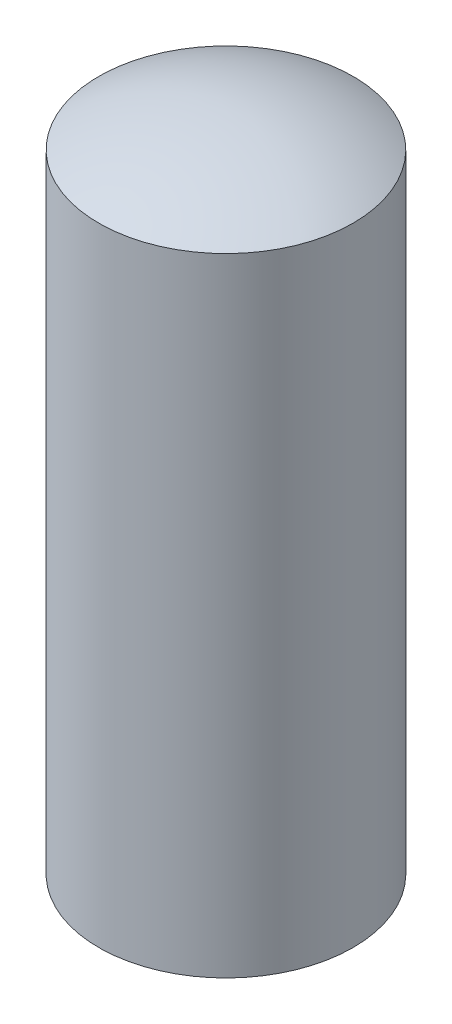
ISO-10303-21;
HEADER;
FILE_DESCRIPTION(('STEP AP214'),'2;1');
FILE_NAME('part.step','',(''),(''),'','','');
FILE_SCHEMA(('AUTOMOTIVE_DESIGN { 1 0 10303 214 1 1 1 1 }'));
ENDSEC;
DATA;
#1=APPLICATION_CONTEXT('core data for automotive mechanical design processes');
#2=APPLICATION_PROTOCOL_DEFINITION('international standard','automotive_design',2000,#1);
#3=PRODUCT_CONTEXT('',#1,'mechanical');
#4=PRODUCT('Part','Part','',(#3));
#5=PRODUCT_RELATED_PRODUCT_CATEGORY('part','',(#4));
#6=PRODUCT_DEFINITION_FORMATION('','',#4);
#7=PRODUCT_DEFINITION_CONTEXT('part definition',#1,'design');
#8=PRODUCT_DEFINITION('design','',#6,#7);
#9=PRODUCT_DEFINITION_SHAPE('','',#8);
#10=(LENGTH_UNIT() NAMED_UNIT(*) SI_UNIT(.MILLI.,.METRE.));
#11=(NAMED_UNIT(*) PLANE_ANGLE_UNIT() SI_UNIT($,.RADIAN.));
#12=(NAMED_UNIT(*) SI_UNIT($,.STERADIAN.) SOLID_ANGLE_UNIT());
#13=UNCERTAINTY_MEASURE_WITH_UNIT(LENGTH_MEASURE(1.E-05),#10,'distance_accuracy_value','');
#14=(GEOMETRIC_REPRESENTATION_CONTEXT(3) GLOBAL_UNCERTAINTY_ASSIGNED_CONTEXT((#13)) GLOBAL_UNIT_ASSIGNED_CONTEXT((#10,
#11,#12)) REPRESENTATION_CONTEXT('',''));
#15=CARTESIAN_POINT('',(0.,0.,0.));
#16=DIRECTION('',(0.,0.,1.));
#17=DIRECTION('',(1.,0.,0.));
#18=AXIS2_PLACEMENT_3D('',#15,#16,#17);
#19=CARTESIAN_POINT('',(0.,2.39375,0.));
#20=DIRECTION('',(1.,0.,0.));
#21=DIRECTION('',(0.,1.,0.));
#22=AXIS2_PLACEMENT_3D('',#19,#20,#21);
#23=SPHERICAL_SURFACE('',#22,1.50625);
#24=CARTESIAN_POINT('',(0.,3.7,0.));
#25=DIRECTION('',(0.,-1.,0.));
#26=DIRECTION('',(1.,0.,0.));
#27=AXIS2_PLACEMENT_3D('',#24,#25,#26);
#28=CIRCLE('',#27,0.75);
#29=CARTESIAN_POINT('',(0.750000000000001,3.7,0.));
#30=VERTEX_POINT('',#29);
#31=EDGE_CURVE('E19',#30,#30,#28,.T.);
#32=ORIENTED_EDGE('',*,*,#31,.F.);
#33=EDGE_LOOP('',(#32));
#34=FACE_BOUND('',#33,.T.);
#35=ADVANCED_FACE('F15',(#34),#23,.T.);
#36=CARTESIAN_POINT('',(0.750000000000001,0.,0.));
#37=DIRECTION('',(0.,-1.,0.));
#38=DIRECTION('',(1.,0.,0.));
#39=AXIS2_PLACEMENT_3D('',#36,#37,#38);
#40=PLANE('',#39);
#41=CARTESIAN_POINT('',(0.,0.,0.));
#42=DIRECTION('',(0.,-1.,0.));
#43=DIRECTION('',(1.,0.,0.));
#44=AXIS2_PLACEMENT_3D('',#41,#42,#43);
#45=CIRCLE('',#44,0.75);
#46=CARTESIAN_POINT('',(0.75,0.,0.));
#47=VERTEX_POINT('',#46);
#48=EDGE_CURVE('E10',#47,#47,#45,.F.);
#49=ORIENTED_EDGE('',*,*,#48,.F.);
#50=EDGE_LOOP('',(#49));
#51=FACE_BOUND('',#50,.T.);
#52=ADVANCED_FACE('F32',(#51),#40,.T.);
#53=CARTESIAN_POINT('',(0.,0.,0.));
#54=DIRECTION('',(0.,-1.,0.));
#55=DIRECTION('',(1.,0.,0.));
#56=AXIS2_PLACEMENT_3D('',#53,#54,#55);
#57=CYLINDRICAL_SURFACE('',#56,0.75);
#58=ORIENTED_EDGE('',*,*,#48,.T.);
#59=EDGE_LOOP('',(#58));
#60=FACE_BOUND('',#59,.T.);
#61=ORIENTED_EDGE('',*,*,#31,.T.);
#62=EDGE_LOOP('',(#61));
#63=FACE_BOUND('',#62,.T.);
#64=ADVANCED_FACE('F29',(#60,#63),#57,.T.);
#65=CLOSED_SHELL('',(#35,#52,#64));
#66=MANIFOLD_SOLID_BREP('B1',#65);
#67=ADVANCED_BREP_SHAPE_REPRESENTATION('',(#18,#66),#14);
#68=SHAPE_DEFINITION_REPRESENTATION(#9,#67);
ENDSEC;
END-ISO-10303-21;
